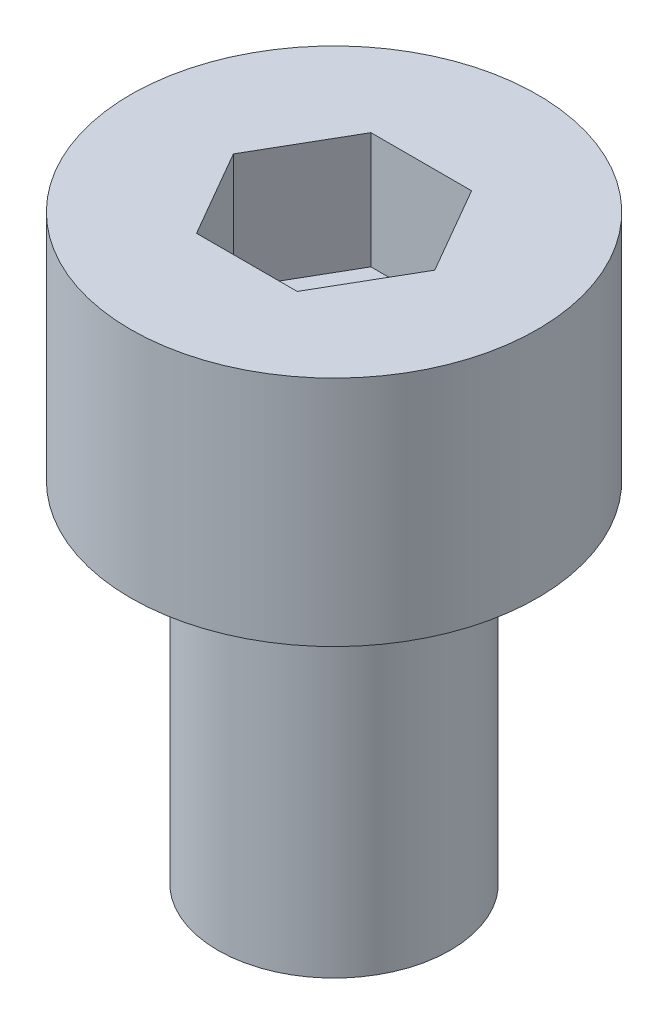
ISO-10303-21;
HEADER;
FILE_DESCRIPTION(('STEP AP214'),'2;1');
FILE_NAME('part.step','',(''),(''),'','','');
FILE_SCHEMA(('AUTOMOTIVE_DESIGN { 1 0 10303 214 1 1 1 1 }'));
ENDSEC;
DATA;
#1=APPLICATION_CONTEXT('core data for automotive mechanical design processes');
#2=APPLICATION_PROTOCOL_DEFINITION('international standard','automotive_design',2000,#1);
#3=PRODUCT_CONTEXT('',#1,'mechanical');
#4=PRODUCT('Part','Part','',(#3));
#5=PRODUCT_RELATED_PRODUCT_CATEGORY('part','',(#4));
#6=PRODUCT_DEFINITION_FORMATION('','',#4);
#7=PRODUCT_DEFINITION_CONTEXT('part definition',#1,'design');
#8=PRODUCT_DEFINITION('design','',#6,#7);
#9=PRODUCT_DEFINITION_SHAPE('','',#8);
#10=(LENGTH_UNIT() NAMED_UNIT(*) SI_UNIT(.MILLI.,.METRE.));
#11=(NAMED_UNIT(*) PLANE_ANGLE_UNIT() SI_UNIT($,.RADIAN.));
#12=(NAMED_UNIT(*) SI_UNIT($,.STERADIAN.) SOLID_ANGLE_UNIT());
#13=UNCERTAINTY_MEASURE_WITH_UNIT(LENGTH_MEASURE(1.E-05),#10,'distance_accuracy_value','');
#14=(GEOMETRIC_REPRESENTATION_CONTEXT(3) GLOBAL_UNCERTAINTY_ASSIGNED_CONTEXT((#13)) GLOBAL_UNIT_ASSIGNED_CONTEXT((#10,
#11,#12)) REPRESENTATION_CONTEXT('',''));
#15=CARTESIAN_POINT('',(0.,0.,0.));
#16=DIRECTION('',(0.,0.,1.));
#17=DIRECTION('',(1.,0.,0.));
#18=AXIS2_PLACEMENT_3D('',#15,#16,#17);
#19=CARTESIAN_POINT('',(0.,-6.,0.));
#20=DIRECTION('',(0.,1.,0.));
#21=DIRECTION('',(0.,0.,1.));
#22=AXIS2_PLACEMENT_3D('',#19,#20,#21);
#23=PLANE('',#22);
#24=CARTESIAN_POINT('',(0.,-5.99999999999999,0.));
#25=DIRECTION('',(0.,1.,0.));
#26=DIRECTION('',(0.,0.,1.));
#27=AXIS2_PLACEMENT_3D('',#24,#25,#26);
#28=CIRCLE('',#27,2.00000000000001);
#29=CARTESIAN_POINT('',(0.,-5.99999999999999,2.00000000000001));
#30=VERTEX_POINT('',#29);
#31=EDGE_CURVE('E11',#30,#30,#28,.T.);
#32=ORIENTED_EDGE('',*,*,#31,.F.);
#33=EDGE_LOOP('',(#32));
#34=FACE_BOUND('',#33,.T.);
#35=ADVANCED_FACE('F34',(#34),#23,.F.);
#36=CARTESIAN_POINT('',(0.,61.6916426261037,0.));
#37=DIRECTION('',(0.,1.,0.));
#38=DIRECTION('',(0.,0.,1.));
#39=AXIS2_PLACEMENT_3D('',#36,#37,#38);
#40=CYLINDRICAL_SURFACE('',#39,2.00000000000001);
#41=CARTESIAN_POINT('',(0.,0.,0.));
#42=DIRECTION('',(0.,1.,0.));
#43=DIRECTION('',(0.,0.,1.));
#44=AXIS2_PLACEMENT_3D('',#41,#42,#43);
#45=CIRCLE('',#44,2.00000000000001);
#46=CARTESIAN_POINT('',(0.,0.,2.00000000000001));
#47=VERTEX_POINT('',#46);
#48=EDGE_CURVE('E41',#47,#47,#45,.T.);
#49=ORIENTED_EDGE('',*,*,#48,.F.);
#50=EDGE_LOOP('',(#49));
#51=FACE_BOUND('',#50,.T.);
#52=ORIENTED_EDGE('',*,*,#31,.T.);
#53=EDGE_LOOP('',(#52));
#54=FACE_BOUND('',#53,.T.);
#55=ADVANCED_FACE('F150',(#51,#54),#40,.T.);
#56=CARTESIAN_POINT('',(2.00000000000001,0.,0.));
#57=DIRECTION('',(0.,1.,0.));
#58=DIRECTION('',(0.,0.,1.));
#59=AXIS2_PLACEMENT_3D('',#56,#57,#58);
#60=PLANE('',#59);
#61=CARTESIAN_POINT('',(0.,0.,0.));
#62=DIRECTION('',(0.,1.,0.));
#63=DIRECTION('',(0.,0.,1.));
#64=AXIS2_PLACEMENT_3D('',#61,#62,#63);
#65=CIRCLE('',#64,3.50000000000001);
#66=CARTESIAN_POINT('',(0.,0.,3.50000000000001));
#67=VERTEX_POINT('',#66);
#68=EDGE_CURVE('E143',#67,#67,#65,.T.);
#69=ORIENTED_EDGE('',*,*,#68,.F.);
#70=EDGE_LOOP('',(#69));
#71=FACE_BOUND('',#70,.T.);
#72=ORIENTED_EDGE('',*,*,#48,.T.);
#73=EDGE_LOOP('',(#72));
#74=FACE_BOUND('',#73,.T.);
#75=ADVANCED_FACE('F148',(#71,#74),#60,.F.);
#76=CARTESIAN_POINT('',(0.,61.6916426261037,0.));
#77=DIRECTION('',(0.,1.,0.));
#78=DIRECTION('',(0.,0.,1.));
#79=AXIS2_PLACEMENT_3D('',#76,#77,#78);
#80=CYLINDRICAL_SURFACE('',#79,3.50000000000001);
#81=CARTESIAN_POINT('',(0.,4.,0.));
#82=DIRECTION('',(0.,1.,0.));
#83=DIRECTION('',(0.,0.,1.));
#84=AXIS2_PLACEMENT_3D('',#81,#82,#83);
#85=CIRCLE('',#84,3.50000000000001);
#86=CARTESIAN_POINT('',(0.,4.,3.50000000000001));
#87=VERTEX_POINT('',#86);
#88=EDGE_CURVE('E135',#87,#87,#85,.T.);
#89=ORIENTED_EDGE('',*,*,#88,.F.);
#90=EDGE_LOOP('',(#89));
#91=FACE_BOUND('',#90,.T.);
#92=ORIENTED_EDGE('',*,*,#68,.T.);
#93=EDGE_LOOP('',(#92));
#94=FACE_BOUND('',#93,.T.);
#95=ADVANCED_FACE('F168',(#91,#94),#80,.T.);
#96=CARTESIAN_POINT('',(3.50000000000001,4.,0.));
#97=DIRECTION('',(0.,-1.,0.));
#98=DIRECTION('',(0.,0.,-1.));
#99=AXIS2_PLACEMENT_3D('',#96,#97,#98);
#100=PLANE('',#99);
#101=DIRECTION('',(-1.,0.,0.));
#102=VECTOR('',#101,1.);
#103=CARTESIAN_POINT('',(0.866025403784438,4.,-1.5));
#104=LINE('',#103,#102);
#105=CARTESIAN_POINT('',(0.866025403784438,4.,-1.5));
#106=VERTEX_POINT('',#105);
#107=CARTESIAN_POINT('',(-0.866025403784439,4.,-1.5));
#108=VERTEX_POINT('',#107);
#109=EDGE_CURVE('E122',#106,#108,#104,.T.);
#110=ORIENTED_EDGE('',*,*,#109,.F.);
#111=DIRECTION('',(-0.5,0.,-0.866025403784439));
#112=VECTOR('',#111,1.);
#113=CARTESIAN_POINT('',(1.73205080756888,4.,0.));
#114=LINE('',#113,#112);
#115=CARTESIAN_POINT('',(1.73205080756888,4.,0.));
#116=VERTEX_POINT('',#115);
#117=EDGE_CURVE('E48',#116,#106,#114,.T.);
#118=ORIENTED_EDGE('',*,*,#117,.F.);
#119=DIRECTION('',(0.5,0.,-0.866025403784439));
#120=VECTOR('',#119,1.);
#121=CARTESIAN_POINT('',(0.866025403784439,4.,1.5));
#122=LINE('',#121,#120);
#123=CARTESIAN_POINT('',(0.866025403784439,4.,1.5));
#124=VERTEX_POINT('',#123);
#125=EDGE_CURVE('E131',#124,#116,#122,.T.);
#126=ORIENTED_EDGE('',*,*,#125,.F.);
#127=DIRECTION('',(1.,0.,0.));
#128=VECTOR('',#127,1.);
#129=CARTESIAN_POINT('',(-0.866025403784438,4.,1.5));
#130=LINE('',#129,#128);
#131=CARTESIAN_POINT('',(-0.866025403784438,4.,1.5));
#132=VERTEX_POINT('',#131);
#133=EDGE_CURVE('E129',#132,#124,#130,.T.);
#134=ORIENTED_EDGE('',*,*,#133,.F.);
#135=DIRECTION('',(0.5,0.,0.866025403784438));
#136=VECTOR('',#135,1.);
#137=CARTESIAN_POINT('',(-1.73205080756888,4.,0.));
#138=LINE('',#137,#136);
#139=CARTESIAN_POINT('',(-1.73205080756888,4.,0.));
#140=VERTEX_POINT('',#139);
#141=EDGE_CURVE('E96',#140,#132,#138,.T.);
#142=ORIENTED_EDGE('',*,*,#141,.F.);
#143=DIRECTION('',(-0.5,0.,0.866025403784439));
#144=VECTOR('',#143,1.);
#145=CARTESIAN_POINT('',(-0.866025403784439,4.,-1.5));
#146=LINE('',#145,#144);
#147=EDGE_CURVE('E125',#108,#140,#146,.T.);
#148=ORIENTED_EDGE('',*,*,#147,.F.);
#149=EDGE_LOOP('',(#110,#118,#126,#134,#142,#148));
#150=FACE_BOUND('',#149,.T.);
#151=ORIENTED_EDGE('',*,*,#88,.T.);
#152=EDGE_LOOP('',(#151));
#153=FACE_BOUND('',#152,.T.);
#154=ADVANCED_FACE('F176',(#150,#153),#100,.F.);
#155=CARTESIAN_POINT('',(1.73205080756888,2.,0.));
#156=DIRECTION('',(0.866025403784439,0.,-0.5));
#157=DIRECTION('',(-0.5,0.,-0.866025403784439));
#158=AXIS2_PLACEMENT_3D('',#155,#156,#157);
#159=PLANE('',#158);
#160=ORIENTED_EDGE('',*,*,#117,.T.);
#161=DIRECTION('',(0.,1.,0.));
#162=VECTOR('',#161,1.);
#163=CARTESIAN_POINT('',(0.866025403784438,2.,-1.5));
#164=LINE('',#163,#162);
#165=CARTESIAN_POINT('',(0.866025403784438,2.,-1.5));
#166=VERTEX_POINT('',#165);
#167=EDGE_CURVE('E78',#166,#106,#164,.T.);
#168=ORIENTED_EDGE('',*,*,#167,.F.);
#169=DIRECTION('',(-0.5,0.,-0.866025403784439));
#170=VECTOR('',#169,1.);
#171=CARTESIAN_POINT('',(1.73205080756888,2.,0.));
#172=LINE('',#171,#170);
#173=CARTESIAN_POINT('',(1.73205080756888,2.,0.));
#174=VERTEX_POINT('',#173);
#175=EDGE_CURVE('E133',#174,#166,#172,.T.);
#176=ORIENTED_EDGE('',*,*,#175,.F.);
#177=DIRECTION('',(0.,1.,0.));
#178=VECTOR('',#177,1.);
#179=CARTESIAN_POINT('',(1.73205080756888,2.,0.));
#180=LINE('',#179,#178);
#181=EDGE_CURVE('E56',#174,#116,#180,.T.);
#182=ORIENTED_EDGE('',*,*,#181,.T.);
#183=EDGE_LOOP('',(#160,#168,#176,#182));
#184=FACE_BOUND('',#183,.T.);
#185=ADVANCED_FACE('F184',(#184),#159,.F.);
#186=CARTESIAN_POINT('',(0.866025403784439,2.,1.5));
#187=DIRECTION('',(0.866025403784439,0.,0.5));
#188=DIRECTION('',(0.5,0.,-0.866025403784439));
#189=AXIS2_PLACEMENT_3D('',#186,#187,#188);
#190=PLANE('',#189);
#191=ORIENTED_EDGE('',*,*,#125,.T.);
#192=ORIENTED_EDGE('',*,*,#181,.F.);
#193=DIRECTION('',(0.5,0.,-0.866025403784439));
#194=VECTOR('',#193,1.);
#195=CARTESIAN_POINT('',(0.866025403784439,2.,1.5));
#196=LINE('',#195,#194);
#197=CARTESIAN_POINT('',(0.866025403784439,2.,1.5));
#198=VERTEX_POINT('',#197);
#199=EDGE_CURVE('E108',#198,#174,#196,.T.);
#200=ORIENTED_EDGE('',*,*,#199,.F.);
#201=DIRECTION('',(0.,1.,0.));
#202=VECTOR('',#201,1.);
#203=CARTESIAN_POINT('',(0.866025403784439,2.,1.5));
#204=LINE('',#203,#202);
#205=EDGE_CURVE('E100',#198,#124,#204,.T.);
#206=ORIENTED_EDGE('',*,*,#205,.T.);
#207=EDGE_LOOP('',(#191,#192,#200,#206));
#208=FACE_BOUND('',#207,.T.);
#209=ADVANCED_FACE('F192',(#208),#190,.F.);
#210=CARTESIAN_POINT('',(-0.866025403784438,2.,1.5));
#211=DIRECTION('',(0.,0.,1.));
#212=DIRECTION('',(1.,0.,0.));
#213=AXIS2_PLACEMENT_3D('',#210,#211,#212);
#214=PLANE('',#213);
#215=ORIENTED_EDGE('',*,*,#133,.T.);
#216=ORIENTED_EDGE('',*,*,#205,.F.);
#217=DIRECTION('',(1.,0.,0.));
#218=VECTOR('',#217,1.);
#219=CARTESIAN_POINT('',(-0.866025403784438,2.,1.5));
#220=LINE('',#219,#218);
#221=CARTESIAN_POINT('',(-0.866025403784438,2.,1.5));
#222=VERTEX_POINT('',#221);
#223=EDGE_CURVE('E104',#222,#198,#220,.T.);
#224=ORIENTED_EDGE('',*,*,#223,.F.);
#225=DIRECTION('',(0.,1.,0.));
#226=VECTOR('',#225,1.);
#227=CARTESIAN_POINT('',(-0.866025403784438,2.,1.5));
#228=LINE('',#227,#226);
#229=EDGE_CURVE('E89',#222,#132,#228,.T.);
#230=ORIENTED_EDGE('',*,*,#229,.T.);
#231=EDGE_LOOP('',(#215,#216,#224,#230));
#232=FACE_BOUND('',#231,.T.);
#233=ADVANCED_FACE('F105',(#232),#214,.F.);
#234=CARTESIAN_POINT('',(-1.73205080756888,2.,0.));
#235=DIRECTION('',(-0.866025403784438,0.,0.5));
#236=DIRECTION('',(0.5,0.,0.866025403784439));
#237=AXIS2_PLACEMENT_3D('',#234,#235,#236);
#238=PLANE('',#237);
#239=ORIENTED_EDGE('',*,*,#141,.T.);
#240=ORIENTED_EDGE('',*,*,#229,.F.);
#241=DIRECTION('',(0.5,0.,0.866025403784438));
#242=VECTOR('',#241,1.);
#243=CARTESIAN_POINT('',(-1.73205080756888,2.,0.));
#244=LINE('',#243,#242);
#245=CARTESIAN_POINT('',(-1.73205080756888,2.,0.));
#246=VERTEX_POINT('',#245);
#247=EDGE_CURVE('E93',#246,#222,#244,.T.);
#248=ORIENTED_EDGE('',*,*,#247,.F.);
#249=DIRECTION('',(0.,1.,0.));
#250=VECTOR('',#249,1.);
#251=CARTESIAN_POINT('',(-1.73205080756888,2.,0.));
#252=LINE('',#251,#250);
#253=EDGE_CURVE('E101',#246,#140,#252,.T.);
#254=ORIENTED_EDGE('',*,*,#253,.T.);
#255=EDGE_LOOP('',(#239,#240,#248,#254));
#256=FACE_BOUND('',#255,.T.);
#257=ADVANCED_FACE('F91',(#256),#238,.F.);
#258=CARTESIAN_POINT('',(-0.866025403784439,2.,-1.5));
#259=DIRECTION('',(-0.866025403784439,0.,-0.5));
#260=DIRECTION('',(-0.5,0.,0.866025403784439));
#261=AXIS2_PLACEMENT_3D('',#258,#259,#260);
#262=PLANE('',#261);
#263=ORIENTED_EDGE('',*,*,#147,.T.);
#264=ORIENTED_EDGE('',*,*,#253,.F.);
#265=DIRECTION('',(-0.5,0.,0.866025403784439));
#266=VECTOR('',#265,1.);
#267=CARTESIAN_POINT('',(-0.866025403784439,2.,-1.5));
#268=LINE('',#267,#266);
#269=CARTESIAN_POINT('',(-0.866025403784439,2.,-1.5));
#270=VERTEX_POINT('',#269);
#271=EDGE_CURVE('E114',#270,#246,#268,.T.);
#272=ORIENTED_EDGE('',*,*,#271,.F.);
#273=DIRECTION('',(0.,1.,0.));
#274=VECTOR('',#273,1.);
#275=CARTESIAN_POINT('',(-0.866025403784439,2.,-1.5));
#276=LINE('',#275,#274);
#277=EDGE_CURVE('E138',#270,#108,#276,.T.);
#278=ORIENTED_EDGE('',*,*,#277,.T.);
#279=EDGE_LOOP('',(#263,#264,#272,#278));
#280=FACE_BOUND('',#279,.T.);
#281=ADVANCED_FACE('F211',(#280),#262,.F.);
#282=CARTESIAN_POINT('',(0.866025403784438,2.,-1.5));
#283=DIRECTION('',(0.,0.,-1.));
#284=DIRECTION('',(-1.,0.,0.));
#285=AXIS2_PLACEMENT_3D('',#282,#283,#284);
#286=PLANE('',#285);
#287=ORIENTED_EDGE('',*,*,#109,.T.);
#288=ORIENTED_EDGE('',*,*,#277,.F.);
#289=DIRECTION('',(-1.,0.,0.));
#290=VECTOR('',#289,1.);
#291=CARTESIAN_POINT('',(0.866025403784438,2.,-1.5));
#292=LINE('',#291,#290);
#293=EDGE_CURVE('E116',#166,#270,#292,.T.);
#294=ORIENTED_EDGE('',*,*,#293,.F.);
#295=ORIENTED_EDGE('',*,*,#167,.T.);
#296=EDGE_LOOP('',(#287,#288,#294,#295));
#297=FACE_BOUND('',#296,.T.);
#298=ADVANCED_FACE('F218',(#297),#286,.F.);
#299=CARTESIAN_POINT('',(1.73205080756888,2.,0.));
#300=DIRECTION('',(0.,-1.,0.));
#301=DIRECTION('',(0.,0.,-1.));
#302=AXIS2_PLACEMENT_3D('',#299,#300,#301);
#303=PLANE('',#302);
#304=ORIENTED_EDGE('',*,*,#175,.T.);
#305=ORIENTED_EDGE('',*,*,#293,.T.);
#306=ORIENTED_EDGE('',*,*,#271,.T.);
#307=ORIENTED_EDGE('',*,*,#247,.T.);
#308=ORIENTED_EDGE('',*,*,#223,.T.);
#309=ORIENTED_EDGE('',*,*,#199,.T.);
#310=EDGE_LOOP('',(#304,#305,#306,#307,#308,#309));
#311=FACE_BOUND('',#310,.T.);
#312=ADVANCED_FACE('F111',(#311),#303,.F.);
#313=CLOSED_SHELL('',(#35,#55,#75,#95,#154,#185,#209,#233,#257,#281,#298,#312));
#314=MANIFOLD_SOLID_BREP('B2',#313);
#315=ADVANCED_BREP_SHAPE_REPRESENTATION('',(#18,#314),#14);
#316=SHAPE_DEFINITION_REPRESENTATION(#9,#315);
ENDSEC;
END-ISO-10303-21;
